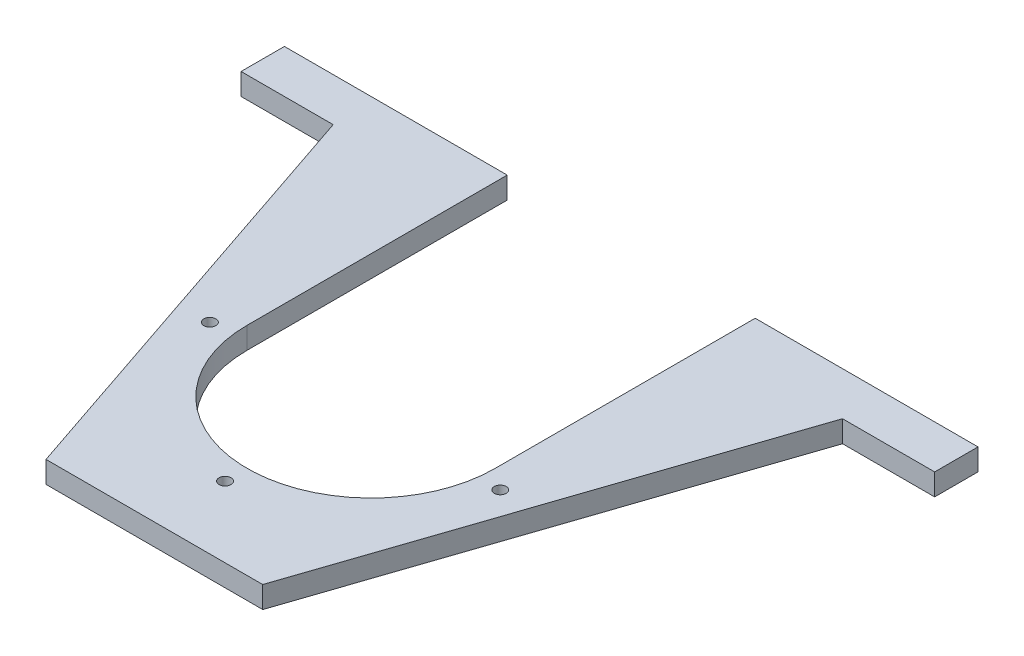
ISO-10303-21;
HEADER;
FILE_DESCRIPTION(('STEP AP214'),'2;1');
FILE_NAME('part.step','',(''),(''),'','','');
FILE_SCHEMA(('AUTOMOTIVE_DESIGN { 1 0 10303 214 1 1 1 1 }'));
ENDSEC;
DATA;
#1=APPLICATION_CONTEXT('core data for automotive mechanical design processes');
#2=APPLICATION_PROTOCOL_DEFINITION('international standard','automotive_design',2000,#1);
#3=PRODUCT_CONTEXT('',#1,'mechanical');
#4=PRODUCT('Part','Part','',(#3));
#5=PRODUCT_RELATED_PRODUCT_CATEGORY('part','',(#4));
#6=PRODUCT_DEFINITION_FORMATION('','',#4);
#7=PRODUCT_DEFINITION_CONTEXT('part definition',#1,'design');
#8=PRODUCT_DEFINITION('design','',#6,#7);
#9=PRODUCT_DEFINITION_SHAPE('','',#8);
#10=(LENGTH_UNIT() NAMED_UNIT(*) SI_UNIT(.MILLI.,.METRE.));
#11=(NAMED_UNIT(*) PLANE_ANGLE_UNIT() SI_UNIT($,.RADIAN.));
#12=(NAMED_UNIT(*) SI_UNIT($,.STERADIAN.) SOLID_ANGLE_UNIT());
#13=UNCERTAINTY_MEASURE_WITH_UNIT(LENGTH_MEASURE(1.E-05),#10,'distance_accuracy_value','');
#14=(GEOMETRIC_REPRESENTATION_CONTEXT(3) GLOBAL_UNCERTAINTY_ASSIGNED_CONTEXT((#13)) GLOBAL_UNIT_ASSIGNED_CONTEXT((#10,
#11,#12)) REPRESENTATION_CONTEXT('',''));
#15=CARTESIAN_POINT('',(0.,0.,0.));
#16=DIRECTION('',(0.,0.,1.));
#17=DIRECTION('',(1.,0.,0.));
#18=AXIS2_PLACEMENT_3D('',#15,#16,#17);
#19=CARTESIAN_POINT('',(-101.6,6.35,-139.7));
#20=DIRECTION('',(0.,0.,1.));
#21=DIRECTION('',(1.,0.,0.));
#22=AXIS2_PLACEMENT_3D('',#19,#20,#21);
#23=PLANE('',#22);
#24=DIRECTION('',(-1.,0.,0.));
#25=VECTOR('',#24,1.);
#26=CARTESIAN_POINT('',(-101.6,6.35,-139.7));
#27=LINE('',#26,#25);
#28=CARTESIAN_POINT('',(-36.322,6.35,-139.7));
#29=VERTEX_POINT('',#28);
#30=CARTESIAN_POINT('',(-101.6,6.35,-139.7));
#31=VERTEX_POINT('',#30);
#32=EDGE_CURVE('E229',#29,#31,#27,.T.);
#33=ORIENTED_EDGE('',*,*,#32,.F.);
#34=DIRECTION('',(0.,1.,0.));
#35=VECTOR('',#34,1.);
#36=CARTESIAN_POINT('',(-36.322,0.,-139.7));
#37=LINE('',#36,#35);
#38=CARTESIAN_POINT('',(-36.322,0.,-139.7));
#39=VERTEX_POINT('',#38);
#40=EDGE_CURVE('E137',#39,#29,#37,.T.);
#41=ORIENTED_EDGE('',*,*,#40,.F.);
#42=DIRECTION('',(-1.,0.,0.));
#43=VECTOR('',#42,1.);
#44=CARTESIAN_POINT('',(-101.6,0.,-139.7));
#45=LINE('',#44,#43);
#46=CARTESIAN_POINT('',(-101.6,0.,-139.7));
#47=VERTEX_POINT('',#46);
#48=EDGE_CURVE('E158',#39,#47,#45,.T.);
#49=ORIENTED_EDGE('',*,*,#48,.T.);
#50=DIRECTION('',(0.,-1.,0.));
#51=VECTOR('',#50,1.);
#52=CARTESIAN_POINT('',(-101.6,6.35,-139.7));
#53=LINE('',#52,#51);
#54=EDGE_CURVE('E187',#31,#47,#53,.T.);
#55=ORIENTED_EDGE('',*,*,#54,.F.);
#56=EDGE_LOOP('',(#33,#41,#49,#55));
#57=FACE_BOUND('',#56,.T.);
#58=ADVANCED_FACE('F40',(#57),#23,.F.);
#59=CARTESIAN_POINT('',(0.,0.,-63.5));
#60=DIRECTION('',(0.,1.,0.));
#61=DIRECTION('',(0.,0.,1.));
#62=AXIS2_PLACEMENT_3D('',#59,#60,#61);
#63=CYLINDRICAL_SURFACE('',#62,36.322);
#64=DIRECTION('',(0.,1.,0.));
#65=VECTOR('',#64,1.);
#66=CARTESIAN_POINT('',(-36.322,0.,-63.5));
#67=LINE('',#66,#65);
#68=CARTESIAN_POINT('',(-36.322,0.,-63.5));
#69=VERTEX_POINT('',#68);
#70=CARTESIAN_POINT('',(-36.322,6.35,-63.5));
#71=VERTEX_POINT('',#70);
#72=EDGE_CURVE('E245',#69,#71,#67,.T.);
#73=ORIENTED_EDGE('',*,*,#72,.T.);
#74=CARTESIAN_POINT('',(0.,6.35,-63.5));
#75=DIRECTION('',(0.,1.,0.));
#76=DIRECTION('',(0.,0.,1.));
#77=AXIS2_PLACEMENT_3D('',#74,#75,#76);
#78=CIRCLE('',#77,36.322);
#79=CARTESIAN_POINT('',(36.322,6.35,-63.5));
#80=VERTEX_POINT('',#79);
#81=EDGE_CURVE('E241',#71,#80,#78,.T.);
#82=ORIENTED_EDGE('',*,*,#81,.T.);
#83=DIRECTION('',(0.,1.,0.));
#84=VECTOR('',#83,1.);
#85=CARTESIAN_POINT('',(36.322,0.,-63.5));
#86=LINE('',#85,#84);
#87=CARTESIAN_POINT('',(36.322,0.,-63.5));
#88=VERTEX_POINT('',#87);
#89=EDGE_CURVE('E138',#88,#80,#86,.T.);
#90=ORIENTED_EDGE('',*,*,#89,.F.);
#91=CARTESIAN_POINT('',(0.,0.,-63.5));
#92=DIRECTION('',(0.,1.,0.));
#93=DIRECTION('',(0.,0.,1.));
#94=AXIS2_PLACEMENT_3D('',#91,#92,#93);
#95=CIRCLE('',#94,36.322);
#96=EDGE_CURVE('E148',#69,#88,#95,.T.);
#97=ORIENTED_EDGE('',*,*,#96,.F.);
#98=EDGE_LOOP('',(#73,#82,#90,#97));
#99=FACE_BOUND('',#98,.T.);
#100=ADVANCED_FACE('F306',(#99),#63,.F.);
#101=CARTESIAN_POINT('',(-31.75,6.35,0.));
#102=DIRECTION('',(0.,0.,-1.));
#103=DIRECTION('',(-1.,0.,0.));
#104=AXIS2_PLACEMENT_3D('',#101,#102,#103);
#105=PLANE('',#104);
#106=DIRECTION('',(1.,0.,0.));
#107=VECTOR('',#106,1.);
#108=CARTESIAN_POINT('',(-31.75,0.,0.));
#109=LINE('',#108,#107);
#110=CARTESIAN_POINT('',(-31.75,0.,0.));
#111=VERTEX_POINT('',#110);
#112=CARTESIAN_POINT('',(31.75,0.,0.));
#113=VERTEX_POINT('',#112);
#114=EDGE_CURVE('E212',#111,#113,#109,.T.);
#115=ORIENTED_EDGE('',*,*,#114,.T.);
#116=DIRECTION('',(0.,-1.,0.));
#117=VECTOR('',#116,1.);
#118=CARTESIAN_POINT('',(31.75,6.35,0.));
#119=LINE('',#118,#117);
#120=CARTESIAN_POINT('',(31.75,6.35,0.));
#121=VERTEX_POINT('',#120);
#122=EDGE_CURVE('E11',#121,#113,#119,.T.);
#123=ORIENTED_EDGE('',*,*,#122,.F.);
#124=DIRECTION('',(1.,0.,0.));
#125=VECTOR('',#124,1.);
#126=CARTESIAN_POINT('',(-31.75,6.35,0.));
#127=LINE('',#126,#125);
#128=CARTESIAN_POINT('',(-31.75,6.35,0.));
#129=VERTEX_POINT('',#128);
#130=EDGE_CURVE('E173',#129,#121,#127,.T.);
#131=ORIENTED_EDGE('',*,*,#130,.F.);
#132=DIRECTION('',(0.,-1.,0.));
#133=VECTOR('',#132,1.);
#134=CARTESIAN_POINT('',(-31.75,6.35,0.));
#135=LINE('',#134,#133);
#136=EDGE_CURVE('E174',#129,#111,#135,.T.);
#137=ORIENTED_EDGE('',*,*,#136,.T.);
#138=EDGE_LOOP('',(#115,#123,#131,#137));
#139=FACE_BOUND('',#138,.T.);
#140=ADVANCED_FACE('F42',(#139),#105,.F.);
#141=CARTESIAN_POINT('',(74.6125,6.35,-127.));
#142=DIRECTION('',(-0.947492278987199,0.,-0.319778644158179));
#143=DIRECTION('',(-0.319778644158179,0.,0.947492278987199));
#144=AXIS2_PLACEMENT_3D('',#141,#142,#143);
#145=PLANE('',#144);
#146=DIRECTION('',(0.319778644158179,0.,-0.947492278987199));
#147=VECTOR('',#146,1.);
#148=CARTESIAN_POINT('',(74.6125,0.,-127.));
#149=LINE('',#148,#147);
#150=CARTESIAN_POINT('',(74.6125,0.,-127.));
#151=VERTEX_POINT('',#150);
#152=EDGE_CURVE('E208',#113,#151,#149,.T.);
#153=ORIENTED_EDGE('',*,*,#152,.T.);
#154=DIRECTION('',(0.,-1.,0.));
#155=VECTOR('',#154,1.);
#156=CARTESIAN_POINT('',(74.6125,6.35,-127.));
#157=LINE('',#156,#155);
#158=CARTESIAN_POINT('',(74.6125,6.35,-127.));
#159=VERTEX_POINT('',#158);
#160=EDGE_CURVE('E49',#159,#151,#157,.T.);
#161=ORIENTED_EDGE('',*,*,#160,.F.);
#162=DIRECTION('',(0.319778644158179,0.,-0.947492278987199));
#163=VECTOR('',#162,1.);
#164=CARTESIAN_POINT('',(74.6125,6.35,-127.));
#165=LINE('',#164,#163);
#166=EDGE_CURVE('E235',#121,#159,#165,.T.);
#167=ORIENTED_EDGE('',*,*,#166,.F.);
#168=ORIENTED_EDGE('',*,*,#122,.T.);
#169=EDGE_LOOP('',(#153,#161,#167,#168));
#170=FACE_BOUND('',#169,.T.);
#171=ADVANCED_FACE('F330',(#170),#145,.F.);
#172=CARTESIAN_POINT('',(101.6,6.35,-127.));
#173=DIRECTION('',(0.,0.,-1.));
#174=DIRECTION('',(-1.,0.,0.));
#175=AXIS2_PLACEMENT_3D('',#172,#173,#174);
#176=PLANE('',#175);
#177=DIRECTION('',(1.,0.,0.));
#178=VECTOR('',#177,1.);
#179=CARTESIAN_POINT('',(101.6,0.,-127.));
#180=LINE('',#179,#178);
#181=CARTESIAN_POINT('',(101.6,0.,-127.));
#182=VERTEX_POINT('',#181);
#183=EDGE_CURVE('E204',#151,#182,#180,.T.);
#184=ORIENTED_EDGE('',*,*,#183,.T.);
#185=DIRECTION('',(0.,-1.,0.));
#186=VECTOR('',#185,1.);
#187=CARTESIAN_POINT('',(101.6,6.35,-127.));
#188=LINE('',#187,#186);
#189=CARTESIAN_POINT('',(101.6,6.35,-127.));
#190=VERTEX_POINT('',#189);
#191=EDGE_CURVE('E193',#190,#182,#188,.T.);
#192=ORIENTED_EDGE('',*,*,#191,.F.);
#193=DIRECTION('',(1.,0.,0.));
#194=VECTOR('',#193,1.);
#195=CARTESIAN_POINT('',(101.6,6.35,-127.));
#196=LINE('',#195,#194);
#197=EDGE_CURVE('E205',#159,#190,#196,.T.);
#198=ORIENTED_EDGE('',*,*,#197,.F.);
#199=ORIENTED_EDGE('',*,*,#160,.T.);
#200=EDGE_LOOP('',(#184,#192,#198,#199));
#201=FACE_BOUND('',#200,.T.);
#202=ADVANCED_FACE('F202',(#201),#176,.F.);
#203=CARTESIAN_POINT('',(101.6,6.35,-139.7));
#204=DIRECTION('',(-1.,0.,0.));
#205=DIRECTION('',(0.,0.,1.));
#206=AXIS2_PLACEMENT_3D('',#203,#204,#205);
#207=PLANE('',#206);
#208=DIRECTION('',(0.,0.,-1.));
#209=VECTOR('',#208,1.);
#210=CARTESIAN_POINT('',(101.6,0.,-139.7));
#211=LINE('',#210,#209);
#212=CARTESIAN_POINT('',(101.6,0.,-139.7));
#213=VERTEX_POINT('',#212);
#214=EDGE_CURVE('E164',#182,#213,#211,.T.);
#215=ORIENTED_EDGE('',*,*,#214,.T.);
#216=DIRECTION('',(0.,-1.,0.));
#217=VECTOR('',#216,1.);
#218=CARTESIAN_POINT('',(101.6,6.35,-139.7));
#219=LINE('',#218,#217);
#220=CARTESIAN_POINT('',(101.6,6.35,-139.7));
#221=VERTEX_POINT('',#220);
#222=EDGE_CURVE('E155',#221,#213,#219,.T.);
#223=ORIENTED_EDGE('',*,*,#222,.F.);
#224=DIRECTION('',(0.,0.,-1.));
#225=VECTOR('',#224,1.);
#226=CARTESIAN_POINT('',(101.6,6.35,-139.7));
#227=LINE('',#226,#225);
#228=EDGE_CURVE('E230',#190,#221,#227,.T.);
#229=ORIENTED_EDGE('',*,*,#228,.F.);
#230=ORIENTED_EDGE('',*,*,#191,.T.);
#231=EDGE_LOOP('',(#215,#223,#229,#230));
#232=FACE_BOUND('',#231,.T.);
#233=ADVANCED_FACE('F336',(#232),#207,.F.);
#234=CARTESIAN_POINT('',(36.322,0.,-139.7));
#235=VERTEX_POINT('',#234);
#236=EDGE_CURVE('E146',#213,#235,#45,.T.);
#237=ORIENTED_EDGE('',*,*,#236,.T.);
#238=DIRECTION('',(0.,1.,0.));
#239=VECTOR('',#238,1.);
#240=CARTESIAN_POINT('',(36.322,0.,-139.7));
#241=LINE('',#240,#239);
#242=CARTESIAN_POINT('',(36.322,6.35,-139.7));
#243=VERTEX_POINT('',#242);
#244=EDGE_CURVE('E128',#235,#243,#241,.T.);
#245=ORIENTED_EDGE('',*,*,#244,.T.);
#246=EDGE_CURVE('E226',#221,#243,#27,.T.);
#247=ORIENTED_EDGE('',*,*,#246,.F.);
#248=ORIENTED_EDGE('',*,*,#222,.T.);
#249=EDGE_LOOP('',(#237,#245,#247,#248));
#250=FACE_BOUND('',#249,.T.);
#251=ADVANCED_FACE('F153',(#250),#23,.F.);
#252=CARTESIAN_POINT('',(-101.6,6.35,-139.7));
#253=DIRECTION('',(1.,0.,0.));
#254=DIRECTION('',(0.,0.,-1.));
#255=AXIS2_PLACEMENT_3D('',#252,#253,#254);
#256=PLANE('',#255);
#257=DIRECTION('',(0.,0.,1.));
#258=VECTOR('',#257,1.);
#259=CARTESIAN_POINT('',(-101.6,0.,-139.7));
#260=LINE('',#259,#258);
#261=CARTESIAN_POINT('',(-101.6,0.,-127.));
#262=VERTEX_POINT('',#261);
#263=EDGE_CURVE('E157',#47,#262,#260,.T.);
#264=ORIENTED_EDGE('',*,*,#263,.T.);
#265=DIRECTION('',(0.,-1.,0.));
#266=VECTOR('',#265,1.);
#267=CARTESIAN_POINT('',(-101.6,6.35,-127.));
#268=LINE('',#267,#266);
#269=CARTESIAN_POINT('',(-101.6,6.35,-127.));
#270=VERTEX_POINT('',#269);
#271=EDGE_CURVE('E183',#270,#262,#268,.T.);
#272=ORIENTED_EDGE('',*,*,#271,.F.);
#273=DIRECTION('',(0.,0.,1.));
#274=VECTOR('',#273,1.);
#275=CARTESIAN_POINT('',(-101.6,6.35,-139.7));
#276=LINE('',#275,#274);
#277=EDGE_CURVE('E223',#31,#270,#276,.T.);
#278=ORIENTED_EDGE('',*,*,#277,.F.);
#279=ORIENTED_EDGE('',*,*,#54,.T.);
#280=EDGE_LOOP('',(#264,#272,#278,#279));
#281=FACE_BOUND('',#280,.T.);
#282=ADVANCED_FACE('F316',(#281),#256,.F.);
#283=CARTESIAN_POINT('',(-101.6,6.35,-127.));
#284=DIRECTION('',(0.,0.,-1.));
#285=DIRECTION('',(-1.,0.,0.));
#286=AXIS2_PLACEMENT_3D('',#283,#284,#285);
#287=PLANE('',#286);
#288=DIRECTION('',(1.,0.,0.));
#289=VECTOR('',#288,1.);
#290=CARTESIAN_POINT('',(-101.6,0.,-127.));
#291=LINE('',#290,#289);
#292=CARTESIAN_POINT('',(-74.6125,0.,-127.));
#293=VERTEX_POINT('',#292);
#294=EDGE_CURVE('E162',#262,#293,#291,.T.);
#295=ORIENTED_EDGE('',*,*,#294,.T.);
#296=DIRECTION('',(0.,-1.,0.));
#297=VECTOR('',#296,1.);
#298=CARTESIAN_POINT('',(-74.6125,6.35,-127.));
#299=LINE('',#298,#297);
#300=CARTESIAN_POINT('',(-74.6125,6.35,-127.));
#301=VERTEX_POINT('',#300);
#302=EDGE_CURVE('E178',#301,#293,#299,.T.);
#303=ORIENTED_EDGE('',*,*,#302,.F.);
#304=DIRECTION('',(1.,0.,0.));
#305=VECTOR('',#304,1.);
#306=CARTESIAN_POINT('',(-101.6,6.35,-127.));
#307=LINE('',#306,#305);
#308=EDGE_CURVE('E220',#270,#301,#307,.T.);
#309=ORIENTED_EDGE('',*,*,#308,.F.);
#310=ORIENTED_EDGE('',*,*,#271,.T.);
#311=EDGE_LOOP('',(#295,#303,#309,#310));
#312=FACE_BOUND('',#311,.T.);
#313=ADVANCED_FACE('F324',(#312),#287,.F.);
#314=CARTESIAN_POINT('',(-74.6125,6.35,-127.));
#315=DIRECTION('',(0.947492278987199,0.,-0.31977864415818));
#316=DIRECTION('',(-0.31977864415818,0.,-0.947492278987199));
#317=AXIS2_PLACEMENT_3D('',#314,#315,#316);
#318=PLANE('',#317);
#319=DIRECTION('',(0.31977864415818,0.,0.947492278987199));
#320=VECTOR('',#319,1.);
#321=CARTESIAN_POINT('',(-74.6125,0.,-127.));
#322=LINE('',#321,#320);
#323=EDGE_CURVE('E170',#293,#111,#322,.T.);
#324=ORIENTED_EDGE('',*,*,#323,.T.);
#325=ORIENTED_EDGE('',*,*,#136,.F.);
#326=DIRECTION('',(0.31977864415818,0.,0.947492278987199));
#327=VECTOR('',#326,1.);
#328=CARTESIAN_POINT('',(-74.6125,6.35,-127.));
#329=LINE('',#328,#327);
#330=EDGE_CURVE('E179',#301,#129,#329,.T.);
#331=ORIENTED_EDGE('',*,*,#330,.F.);
#332=ORIENTED_EDGE('',*,*,#302,.T.);
#333=EDGE_LOOP('',(#324,#325,#331,#332));
#334=FACE_BOUND('',#333,.T.);
#335=ADVANCED_FACE('F297',(#334),#318,.F.);
#336=CARTESIAN_POINT('',(0.,6.35,0.));
#337=DIRECTION('',(0.,-1.,0.));
#338=DIRECTION('',(0.,0.,-1.));
#339=AXIS2_PLACEMENT_3D('',#336,#337,#338);
#340=PLANE('',#339);
#341=CARTESIAN_POINT('',(0.,6.35,-20.701));
#342=DIRECTION('',(0.,1.,0.));
#343=DIRECTION('',(0.,0.,1.));
#344=AXIS2_PLACEMENT_3D('',#341,#342,#343);
#345=CIRCLE('',#344,1.75);
#346=CARTESIAN_POINT('',(0.,6.35,-18.951));
#347=VERTEX_POINT('',#346);
#348=EDGE_CURVE('E277',#347,#347,#345,.T.);
#349=ORIENTED_EDGE('',*,*,#348,.F.);
#350=EDGE_LOOP('',(#349));
#351=FACE_BOUND('',#350,.T.);
#352=CARTESIAN_POINT('',(42.5402609300883,6.35,-58.801));
#353=DIRECTION('',(0.,1.,0.));
#354=DIRECTION('',(0.,0.,1.));
#355=AXIS2_PLACEMENT_3D('',#352,#353,#354);
#356=CIRCLE('',#355,1.75);
#357=CARTESIAN_POINT('',(42.5402609300883,6.35,-57.051));
#358=VERTEX_POINT('',#357);
#359=EDGE_CURVE('E269',#358,#358,#356,.T.);
#360=ORIENTED_EDGE('',*,*,#359,.F.);
#361=EDGE_LOOP('',(#360));
#362=FACE_BOUND('',#361,.T.);
#363=CARTESIAN_POINT('',(-42.5402609300883,6.35,-58.801));
#364=DIRECTION('',(0.,1.,0.));
#365=DIRECTION('',(0.,0.,1.));
#366=AXIS2_PLACEMENT_3D('',#363,#364,#365);
#367=CIRCLE('',#366,1.75);
#368=CARTESIAN_POINT('',(-42.5402609300883,6.35,-57.051));
#369=VERTEX_POINT('',#368);
#370=EDGE_CURVE('E261',#369,#369,#367,.T.);
#371=ORIENTED_EDGE('',*,*,#370,.F.);
#372=EDGE_LOOP('',(#371));
#373=FACE_BOUND('',#372,.T.);
#374=ORIENTED_EDGE('',*,*,#81,.F.);
#375=DIRECTION('',(0.,0.,1.));
#376=VECTOR('',#375,1.);
#377=CARTESIAN_POINT('',(-36.322,6.35,-63.5));
#378=LINE('',#377,#376);
#379=EDGE_CURVE('E56',#29,#71,#378,.T.);
#380=ORIENTED_EDGE('',*,*,#379,.F.);
#381=ORIENTED_EDGE('',*,*,#32,.T.);
#382=ORIENTED_EDGE('',*,*,#277,.T.);
#383=ORIENTED_EDGE('',*,*,#308,.T.);
#384=ORIENTED_EDGE('',*,*,#330,.T.);
#385=ORIENTED_EDGE('',*,*,#130,.T.);
#386=ORIENTED_EDGE('',*,*,#166,.T.);
#387=ORIENTED_EDGE('',*,*,#197,.T.);
#388=ORIENTED_EDGE('',*,*,#228,.T.);
#389=ORIENTED_EDGE('',*,*,#246,.T.);
#390=DIRECTION('',(0.,0.,-1.));
#391=VECTOR('',#390,1.);
#392=CARTESIAN_POINT('',(36.322,6.35,-63.5));
#393=LINE('',#392,#391);
#394=EDGE_CURVE('E131',#80,#243,#393,.T.);
#395=ORIENTED_EDGE('',*,*,#394,.F.);
#396=EDGE_LOOP('',(#374,#380,#381,#382,#383,#384,#385,#386,#387,#388,#389,#395));
#397=FACE_BOUND('',#396,.T.);
#398=ADVANCED_FACE('F294',(#351,#362,#373,#397),#340,.F.);
#399=CARTESIAN_POINT('',(0.,0.,0.));
#400=DIRECTION('',(0.,-1.,0.));
#401=DIRECTION('',(0.,0.,-1.));
#402=AXIS2_PLACEMENT_3D('',#399,#400,#401);
#403=PLANE('',#402);
#404=CARTESIAN_POINT('',(0.,0.,-20.701));
#405=DIRECTION('',(0.,1.,0.));
#406=DIRECTION('',(0.,0.,1.));
#407=AXIS2_PLACEMENT_3D('',#404,#405,#406);
#408=CIRCLE('',#407,1.75);
#409=CARTESIAN_POINT('',(0.,0.,-18.951));
#410=VERTEX_POINT('',#409);
#411=EDGE_CURVE('E258',#410,#410,#408,.T.);
#412=ORIENTED_EDGE('',*,*,#411,.T.);
#413=EDGE_LOOP('',(#412));
#414=FACE_BOUND('',#413,.T.);
#415=CARTESIAN_POINT('',(42.5402609300883,0.,-58.801));
#416=DIRECTION('',(0.,1.,0.));
#417=DIRECTION('',(0.,0.,1.));
#418=AXIS2_PLACEMENT_3D('',#415,#416,#417);
#419=CIRCLE('',#418,1.75);
#420=CARTESIAN_POINT('',(42.5402609300883,0.,-57.051));
#421=VERTEX_POINT('',#420);
#422=EDGE_CURVE('E273',#421,#421,#419,.T.);
#423=ORIENTED_EDGE('',*,*,#422,.T.);
#424=EDGE_LOOP('',(#423));
#425=FACE_BOUND('',#424,.T.);
#426=CARTESIAN_POINT('',(-42.5402609300883,0.,-58.801));
#427=DIRECTION('',(0.,1.,0.));
#428=DIRECTION('',(0.,0.,1.));
#429=AXIS2_PLACEMENT_3D('',#426,#427,#428);
#430=CIRCLE('',#429,1.75);
#431=CARTESIAN_POINT('',(-42.5402609300883,0.,-57.051));
#432=VERTEX_POINT('',#431);
#433=EDGE_CURVE('E265',#432,#432,#430,.T.);
#434=ORIENTED_EDGE('',*,*,#433,.T.);
#435=EDGE_LOOP('',(#434));
#436=FACE_BOUND('',#435,.T.);
#437=DIRECTION('',(0.,0.,1.));
#438=VECTOR('',#437,1.);
#439=CARTESIAN_POINT('',(-36.322,0.,-63.5));
#440=LINE('',#439,#438);
#441=EDGE_CURVE('E150',#39,#69,#440,.T.);
#442=ORIENTED_EDGE('',*,*,#441,.T.);
#443=ORIENTED_EDGE('',*,*,#96,.T.);
#444=DIRECTION('',(0.,0.,-1.));
#445=VECTOR('',#444,1.);
#446=CARTESIAN_POINT('',(36.322,0.,-63.5));
#447=LINE('',#446,#445);
#448=EDGE_CURVE('E64',#88,#235,#447,.T.);
#449=ORIENTED_EDGE('',*,*,#448,.T.);
#450=ORIENTED_EDGE('',*,*,#236,.F.);
#451=ORIENTED_EDGE('',*,*,#214,.F.);
#452=ORIENTED_EDGE('',*,*,#183,.F.);
#453=ORIENTED_EDGE('',*,*,#152,.F.);
#454=ORIENTED_EDGE('',*,*,#114,.F.);
#455=ORIENTED_EDGE('',*,*,#323,.F.);
#456=ORIENTED_EDGE('',*,*,#294,.F.);
#457=ORIENTED_EDGE('',*,*,#263,.F.);
#458=ORIENTED_EDGE('',*,*,#48,.F.);
#459=EDGE_LOOP('',(#442,#443,#449,#450,#451,#452,#453,#454,#455,#456,#457,#458));
#460=FACE_BOUND('',#459,.T.);
#461=ADVANCED_FACE('F144',(#414,#425,#436,#460),#403,.T.);
#462=CARTESIAN_POINT('',(36.322,0.,-63.5));
#463=DIRECTION('',(1.,0.,0.));
#464=DIRECTION('',(0.,0.,-1.));
#465=AXIS2_PLACEMENT_3D('',#462,#463,#464);
#466=PLANE('',#465);
#467=ORIENTED_EDGE('',*,*,#394,.T.);
#468=ORIENTED_EDGE('',*,*,#244,.F.);
#469=ORIENTED_EDGE('',*,*,#448,.F.);
#470=ORIENTED_EDGE('',*,*,#89,.T.);
#471=EDGE_LOOP('',(#467,#468,#469,#470));
#472=FACE_BOUND('',#471,.T.);
#473=ADVANCED_FACE('F129',(#472),#466,.F.);
#474=CARTESIAN_POINT('',(-36.322,0.,-63.5));
#475=DIRECTION('',(-1.,0.,0.));
#476=DIRECTION('',(0.,0.,1.));
#477=AXIS2_PLACEMENT_3D('',#474,#475,#476);
#478=PLANE('',#477);
#479=ORIENTED_EDGE('',*,*,#379,.T.);
#480=ORIENTED_EDGE('',*,*,#72,.F.);
#481=ORIENTED_EDGE('',*,*,#441,.F.);
#482=ORIENTED_EDGE('',*,*,#40,.T.);
#483=EDGE_LOOP('',(#479,#480,#481,#482));
#484=FACE_BOUND('',#483,.T.);
#485=ADVANCED_FACE('F307',(#484),#478,.F.);
#486=CARTESIAN_POINT('',(-42.5402609300883,0.,-58.801));
#487=DIRECTION('',(0.,1.,0.));
#488=DIRECTION('',(0.,0.,1.));
#489=AXIS2_PLACEMENT_3D('',#486,#487,#488);
#490=CYLINDRICAL_SURFACE('',#489,1.75);
#491=ORIENTED_EDGE('',*,*,#433,.F.);
#492=EDGE_LOOP('',(#491));
#493=FACE_BOUND('',#492,.T.);
#494=ORIENTED_EDGE('',*,*,#370,.T.);
#495=EDGE_LOOP('',(#494));
#496=FACE_BOUND('',#495,.T.);
#497=ADVANCED_FACE('F413',(#493,#496),#490,.F.);
#498=CARTESIAN_POINT('',(42.5402609300883,0.,-58.801));
#499=DIRECTION('',(0.,1.,0.));
#500=DIRECTION('',(0.,0.,1.));
#501=AXIS2_PLACEMENT_3D('',#498,#499,#500);
#502=CYLINDRICAL_SURFACE('',#501,1.75);
#503=ORIENTED_EDGE('',*,*,#422,.F.);
#504=EDGE_LOOP('',(#503));
#505=FACE_BOUND('',#504,.T.);
#506=ORIENTED_EDGE('',*,*,#359,.T.);
#507=EDGE_LOOP('',(#506));
#508=FACE_BOUND('',#507,.T.);
#509=ADVANCED_FACE('F290',(#505,#508),#502,.F.);
#510=CARTESIAN_POINT('',(0.,0.,-20.701));
#511=DIRECTION('',(0.,1.,0.));
#512=DIRECTION('',(0.,0.,1.));
#513=AXIS2_PLACEMENT_3D('',#510,#511,#512);
#514=CYLINDRICAL_SURFACE('',#513,1.75);
#515=ORIENTED_EDGE('',*,*,#411,.F.);
#516=EDGE_LOOP('',(#515));
#517=FACE_BOUND('',#516,.T.);
#518=ORIENTED_EDGE('',*,*,#348,.T.);
#519=EDGE_LOOP('',(#518));
#520=FACE_BOUND('',#519,.T.);
#521=ADVANCED_FACE('F287',(#517,#520),#514,.F.);
#522=CLOSED_SHELL('',(#58,#100,#140,#171,#202,#233,#251,#282,#313,#335,#398,#461,#473,#485,#497,
#509,#521));
#523=MANIFOLD_SOLID_BREP('B2',#522);
#524=ADVANCED_BREP_SHAPE_REPRESENTATION('',(#18,#523),#14);
#525=SHAPE_DEFINITION_REPRESENTATION(#9,#524);
ENDSEC;
END-ISO-10303-21;
